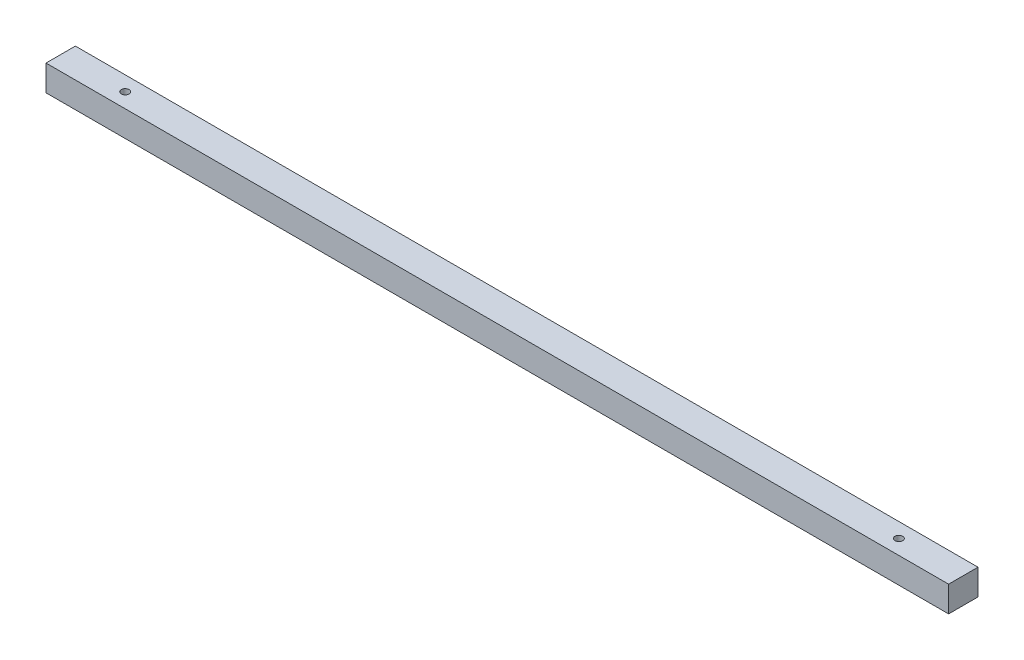
ISO-10303-21;
HEADER;
FILE_DESCRIPTION(('STEP AP214'),'2;1');
FILE_NAME('part.step','',(''),(''),'','','');
FILE_SCHEMA(('AUTOMOTIVE_DESIGN { 1 0 10303 214 1 1 1 1 }'));
ENDSEC;
DATA;
#1=APPLICATION_CONTEXT('core data for automotive mechanical design processes');
#2=APPLICATION_PROTOCOL_DEFINITION('international standard','automotive_design',2000,#1);
#3=PRODUCT_CONTEXT('',#1,'mechanical');
#4=PRODUCT('Part','Part','',(#3));
#5=PRODUCT_RELATED_PRODUCT_CATEGORY('part','',(#4));
#6=PRODUCT_DEFINITION_FORMATION('','',#4);
#7=PRODUCT_DEFINITION_CONTEXT('part definition',#1,'design');
#8=PRODUCT_DEFINITION('design','',#6,#7);
#9=PRODUCT_DEFINITION_SHAPE('','',#8);
#10=(LENGTH_UNIT() NAMED_UNIT(*) SI_UNIT(.MILLI.,.METRE.));
#11=(NAMED_UNIT(*) PLANE_ANGLE_UNIT() SI_UNIT($,.RADIAN.));
#12=(NAMED_UNIT(*) SI_UNIT($,.STERADIAN.) SOLID_ANGLE_UNIT());
#13=UNCERTAINTY_MEASURE_WITH_UNIT(LENGTH_MEASURE(1.E-05),#10,'distance_accuracy_value','');
#14=(GEOMETRIC_REPRESENTATION_CONTEXT(3) GLOBAL_UNCERTAINTY_ASSIGNED_CONTEXT((#13)) GLOBAL_UNIT_ASSIGNED_CONTEXT((#10,
#11,#12)) REPRESENTATION_CONTEXT('',''));
#15=CARTESIAN_POINT('',(0.,0.,0.));
#16=DIRECTION('',(0.,0.,1.));
#17=DIRECTION('',(1.,0.,0.));
#18=AXIS2_PLACEMENT_3D('',#15,#16,#17);
#19=CARTESIAN_POINT('',(0.,10.,0.));
#20=DIRECTION('',(0.,-1.,0.));
#21=DIRECTION('',(0.,0.,-1.));
#22=AXIS2_PLACEMENT_3D('',#19,#20,#21);
#23=PLANE('',#22);
#24=DIRECTION('',(0.,0.,-1.));
#25=VECTOR('',#24,1.);
#26=CARTESIAN_POINT('',(-175.,10.,5.7));
#27=LINE('',#26,#25);
#28=CARTESIAN_POINT('',(-175.,10.,5.7));
#29=VERTEX_POINT('',#28);
#30=CARTESIAN_POINT('',(-175.,10.,-5.7));
#31=VERTEX_POINT('',#30);
#32=EDGE_CURVE('E126',#29,#31,#27,.T.);
#33=ORIENTED_EDGE('',*,*,#32,.F.);
#34=DIRECTION('',(1.,0.,0.));
#35=VECTOR('',#34,1.);
#36=CARTESIAN_POINT('',(-175.,10.,5.7));
#37=LINE('',#36,#35);
#38=CARTESIAN_POINT('',(174.999999999999,10.,5.7));
#39=VERTEX_POINT('',#38);
#40=EDGE_CURVE('E116',#29,#39,#37,.T.);
#41=ORIENTED_EDGE('',*,*,#40,.T.);
#42=DIRECTION('',(0.,0.,-1.));
#43=VECTOR('',#42,1.);
#44=CARTESIAN_POINT('',(174.999999999999,10.,5.7));
#45=LINE('',#44,#43);
#46=CARTESIAN_POINT('',(174.999999999999,10.,-5.7));
#47=VERTEX_POINT('',#46);
#48=EDGE_CURVE('E111',#39,#47,#45,.T.);
#49=ORIENTED_EDGE('',*,*,#48,.T.);
#50=DIRECTION('',(1.,0.,0.));
#51=VECTOR('',#50,1.);
#52=CARTESIAN_POINT('',(-175.,10.,-5.7));
#53=LINE('',#52,#51);
#54=EDGE_CURVE('E115',#31,#47,#53,.T.);
#55=ORIENTED_EDGE('',*,*,#54,.F.);
#56=EDGE_LOOP('',(#33,#41,#49,#55));
#57=FACE_BOUND('',#56,.T.);
#58=CARTESIAN_POINT('',(-150.,10.,0.));
#59=DIRECTION('',(0.,1.,0.));
#60=DIRECTION('',(0.,0.,1.));
#61=AXIS2_PLACEMENT_3D('',#58,#59,#60);
#62=CIRCLE('',#61,1.5);
#63=CARTESIAN_POINT('',(-150.,10.,1.5));
#64=VERTEX_POINT('',#63);
#65=EDGE_CURVE('E136',#64,#64,#62,.T.);
#66=ORIENTED_EDGE('',*,*,#65,.F.);
#67=EDGE_LOOP('',(#66));
#68=FACE_BOUND('',#67,.T.);
#69=CARTESIAN_POINT('',(150.,10.,0.));
#70=DIRECTION('',(0.,1.,0.));
#71=DIRECTION('',(0.,0.,1.));
#72=AXIS2_PLACEMENT_3D('',#69,#70,#71);
#73=CIRCLE('',#72,1.5);
#74=CARTESIAN_POINT('',(150.,10.,1.49999999999994));
#75=VERTEX_POINT('',#74);
#76=EDGE_CURVE('E177',#75,#75,#73,.T.);
#77=ORIENTED_EDGE('',*,*,#76,.F.);
#78=EDGE_LOOP('',(#77));
#79=FACE_BOUND('',#78,.T.);
#80=ADVANCED_FACE('F65',(#57,#68,#79),#23,.F.);
#81=CARTESIAN_POINT('',(0.,0.,0.));
#82=DIRECTION('',(0.,-1.,0.));
#83=DIRECTION('',(0.,0.,-1.));
#84=AXIS2_PLACEMENT_3D('',#81,#82,#83);
#85=PLANE('',#84);
#86=CARTESIAN_POINT('',(-150.,0.,0.));
#87=DIRECTION('',(0.,1.,0.));
#88=DIRECTION('',(0.,0.,1.));
#89=AXIS2_PLACEMENT_3D('',#86,#87,#88);
#90=CIRCLE('',#89,1.5);
#91=CARTESIAN_POINT('',(-150.,0.,1.5));
#92=VERTEX_POINT('',#91);
#93=EDGE_CURVE('E176',#92,#92,#90,.T.);
#94=ORIENTED_EDGE('',*,*,#93,.T.);
#95=EDGE_LOOP('',(#94));
#96=FACE_BOUND('',#95,.T.);
#97=DIRECTION('',(0.,0.,-1.));
#98=VECTOR('',#97,1.);
#99=CARTESIAN_POINT('',(-175.,0.,5.7));
#100=LINE('',#99,#98);
#101=CARTESIAN_POINT('',(-175.,0.,5.7));
#102=VERTEX_POINT('',#101);
#103=CARTESIAN_POINT('',(-175.,0.,-5.7));
#104=VERTEX_POINT('',#103);
#105=EDGE_CURVE('E132',#102,#104,#100,.T.);
#106=ORIENTED_EDGE('',*,*,#105,.T.);
#107=DIRECTION('',(1.,0.,0.));
#108=VECTOR('',#107,1.);
#109=CARTESIAN_POINT('',(-175.,0.,-5.7));
#110=LINE('',#109,#108);
#111=CARTESIAN_POINT('',(174.999999999999,0.,-5.7));
#112=VERTEX_POINT('',#111);
#113=EDGE_CURVE('E135',#104,#112,#110,.T.);
#114=ORIENTED_EDGE('',*,*,#113,.T.);
#115=DIRECTION('',(0.,0.,-1.));
#116=VECTOR('',#115,1.);
#117=CARTESIAN_POINT('',(174.999999999999,0.,5.7));
#118=LINE('',#117,#116);
#119=CARTESIAN_POINT('',(174.999999999999,0.,5.7));
#120=VERTEX_POINT('',#119);
#121=EDGE_CURVE('E123',#120,#112,#118,.T.);
#122=ORIENTED_EDGE('',*,*,#121,.F.);
#123=DIRECTION('',(1.,0.,0.));
#124=VECTOR('',#123,1.);
#125=CARTESIAN_POINT('',(-175.,0.,5.7));
#126=LINE('',#125,#124);
#127=EDGE_CURVE('E99',#102,#120,#126,.T.);
#128=ORIENTED_EDGE('',*,*,#127,.F.);
#129=EDGE_LOOP('',(#106,#114,#122,#128));
#130=FACE_BOUND('',#129,.T.);
#131=CARTESIAN_POINT('',(150.,0.,0.));
#132=DIRECTION('',(0.,1.,0.));
#133=DIRECTION('',(0.,0.,1.));
#134=AXIS2_PLACEMENT_3D('',#131,#132,#133);
#135=CIRCLE('',#134,1.5);
#136=CARTESIAN_POINT('',(150.,0.,1.49999999999994));
#137=VERTEX_POINT('',#136);
#138=EDGE_CURVE('E180',#137,#137,#135,.T.);
#139=ORIENTED_EDGE('',*,*,#138,.T.);
#140=EDGE_LOOP('',(#139));
#141=FACE_BOUND('',#140,.T.);
#142=ADVANCED_FACE('F141',(#96,#130,#141),#85,.T.);
#143=CARTESIAN_POINT('',(-175.,10.,5.7));
#144=DIRECTION('',(-1.,0.,0.));
#145=DIRECTION('',(0.,0.,1.));
#146=AXIS2_PLACEMENT_3D('',#143,#144,#145);
#147=PLANE('',#146);
#148=ORIENTED_EDGE('',*,*,#105,.F.);
#149=DIRECTION('',(0.,-1.,0.));
#150=VECTOR('',#149,1.);
#151=CARTESIAN_POINT('',(-175.,10.,5.7));
#152=LINE('',#151,#150);
#153=EDGE_CURVE('E12',#29,#102,#152,.T.);
#154=ORIENTED_EDGE('',*,*,#153,.F.);
#155=ORIENTED_EDGE('',*,*,#32,.T.);
#156=DIRECTION('',(0.,-1.,0.));
#157=VECTOR('',#156,1.);
#158=CARTESIAN_POINT('',(-175.,10.,-5.7));
#159=LINE('',#158,#157);
#160=EDGE_CURVE('E69',#31,#104,#159,.T.);
#161=ORIENTED_EDGE('',*,*,#160,.T.);
#162=EDGE_LOOP('',(#148,#154,#155,#161));
#163=FACE_BOUND('',#162,.T.);
#164=ADVANCED_FACE('F67',(#163),#147,.T.);
#165=CARTESIAN_POINT('',(-175.,10.,5.7));
#166=DIRECTION('',(0.,0.,-1.));
#167=DIRECTION('',(-1.,0.,0.));
#168=AXIS2_PLACEMENT_3D('',#165,#166,#167);
#169=PLANE('',#168);
#170=ORIENTED_EDGE('',*,*,#127,.T.);
#171=DIRECTION('',(0.,-1.,0.));
#172=VECTOR('',#171,1.);
#173=CARTESIAN_POINT('',(174.999999999999,10.,5.7));
#174=LINE('',#173,#172);
#175=EDGE_CURVE('E75',#39,#120,#174,.T.);
#176=ORIENTED_EDGE('',*,*,#175,.F.);
#177=ORIENTED_EDGE('',*,*,#40,.F.);
#178=ORIENTED_EDGE('',*,*,#153,.T.);
#179=EDGE_LOOP('',(#170,#176,#177,#178));
#180=FACE_BOUND('',#179,.T.);
#181=ADVANCED_FACE('F144',(#180),#169,.F.);
#182=CARTESIAN_POINT('',(174.999999999999,10.,5.7));
#183=DIRECTION('',(-1.,0.,0.));
#184=DIRECTION('',(0.,0.,1.));
#185=AXIS2_PLACEMENT_3D('',#182,#183,#184);
#186=PLANE('',#185);
#187=ORIENTED_EDGE('',*,*,#121,.T.);
#188=DIRECTION('',(0.,-1.,0.));
#189=VECTOR('',#188,1.);
#190=CARTESIAN_POINT('',(174.999999999999,10.,-5.7));
#191=LINE('',#190,#189);
#192=EDGE_CURVE('E120',#47,#112,#191,.T.);
#193=ORIENTED_EDGE('',*,*,#192,.F.);
#194=ORIENTED_EDGE('',*,*,#48,.F.);
#195=ORIENTED_EDGE('',*,*,#175,.T.);
#196=EDGE_LOOP('',(#187,#193,#194,#195));
#197=FACE_BOUND('',#196,.T.);
#198=ADVANCED_FACE('F121',(#197),#186,.F.);
#199=CARTESIAN_POINT('',(-175.,10.,-5.7));
#200=DIRECTION('',(0.,0.,-1.));
#201=DIRECTION('',(-1.,0.,0.));
#202=AXIS2_PLACEMENT_3D('',#199,#200,#201);
#203=PLANE('',#202);
#204=ORIENTED_EDGE('',*,*,#113,.F.);
#205=ORIENTED_EDGE('',*,*,#160,.F.);
#206=ORIENTED_EDGE('',*,*,#54,.T.);
#207=ORIENTED_EDGE('',*,*,#192,.T.);
#208=EDGE_LOOP('',(#204,#205,#206,#207));
#209=FACE_BOUND('',#208,.T.);
#210=ADVANCED_FACE('F125',(#209),#203,.T.);
#211=CARTESIAN_POINT('',(-150.,10.,0.));
#212=DIRECTION('',(0.,-1.,0.));
#213=DIRECTION('',(0.,0.,-1.));
#214=AXIS2_PLACEMENT_3D('',#211,#212,#213);
#215=CYLINDRICAL_SURFACE('',#214,1.5);
#216=ORIENTED_EDGE('',*,*,#65,.T.);
#217=EDGE_LOOP('',(#216));
#218=FACE_BOUND('',#217,.T.);
#219=ORIENTED_EDGE('',*,*,#93,.F.);
#220=EDGE_LOOP('',(#219));
#221=FACE_BOUND('',#220,.T.);
#222=ADVANCED_FACE('F157',(#218,#221),#215,.F.);
#223=CARTESIAN_POINT('',(150.,10.,0.));
#224=DIRECTION('',(0.,-1.,0.));
#225=DIRECTION('',(0.,0.,-1.));
#226=AXIS2_PLACEMENT_3D('',#223,#224,#225);
#227=CYLINDRICAL_SURFACE('',#226,1.5);
#228=ORIENTED_EDGE('',*,*,#76,.T.);
#229=EDGE_LOOP('',(#228));
#230=FACE_BOUND('',#229,.T.);
#231=ORIENTED_EDGE('',*,*,#138,.F.);
#232=EDGE_LOOP('',(#231));
#233=FACE_BOUND('',#232,.T.);
#234=ADVANCED_FACE('F165',(#230,#233),#227,.F.);
#235=CLOSED_SHELL('',(#80,#142,#164,#181,#198,#210,#222,#234));
#236=MANIFOLD_SOLID_BREP('B2',#235);
#237=ADVANCED_BREP_SHAPE_REPRESENTATION('',(#18,#236),#14);
#238=SHAPE_DEFINITION_REPRESENTATION(#9,#237);
ENDSEC;
END-ISO-10303-21;
